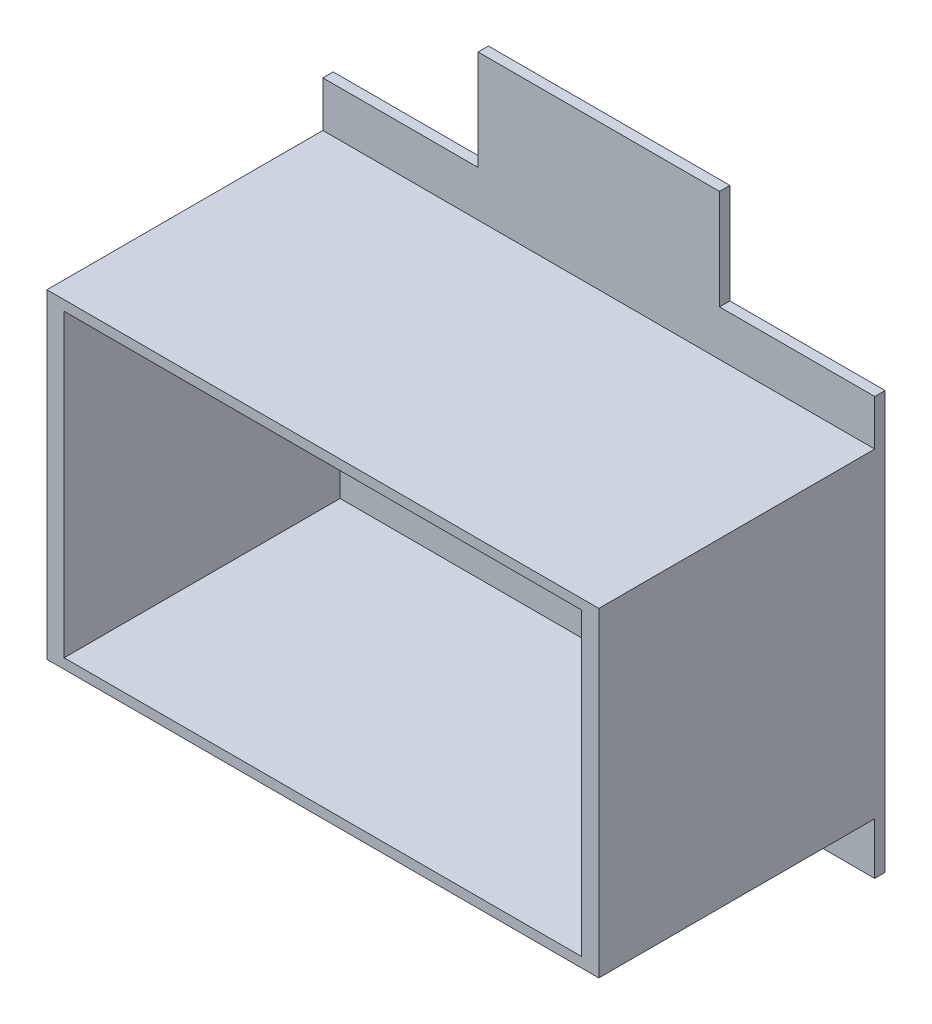
ISO-10303-21;
HEADER;
FILE_DESCRIPTION(('STEP AP214'),'2;1');
FILE_NAME('part.step','',(''),(''),'','','');
FILE_SCHEMA(('AUTOMOTIVE_DESIGN { 1 0 10303 214 1 1 1 1 }'));
ENDSEC;
DATA;
#1=APPLICATION_CONTEXT('core data for automotive mechanical design processes');
#2=APPLICATION_PROTOCOL_DEFINITION('international standard','automotive_design',2000,#1);
#3=PRODUCT_CONTEXT('',#1,'mechanical');
#4=PRODUCT('Part','Part','',(#3));
#5=PRODUCT_RELATED_PRODUCT_CATEGORY('part','',(#4));
#6=PRODUCT_DEFINITION_FORMATION('','',#4);
#7=PRODUCT_DEFINITION_CONTEXT('part definition',#1,'design');
#8=PRODUCT_DEFINITION('design','',#6,#7);
#9=PRODUCT_DEFINITION_SHAPE('','',#8);
#10=(LENGTH_UNIT() NAMED_UNIT(*) SI_UNIT(.MILLI.,.METRE.));
#11=(NAMED_UNIT(*) PLANE_ANGLE_UNIT() SI_UNIT($,.RADIAN.));
#12=(NAMED_UNIT(*) SI_UNIT($,.STERADIAN.) SOLID_ANGLE_UNIT());
#13=UNCERTAINTY_MEASURE_WITH_UNIT(LENGTH_MEASURE(1.E-05),#10,'distance_accuracy_value','');
#14=(GEOMETRIC_REPRESENTATION_CONTEXT(3) GLOBAL_UNCERTAINTY_ASSIGNED_CONTEXT((#13)) GLOBAL_UNIT_ASSIGNED_CONTEXT((#10,
#11,#12)) REPRESENTATION_CONTEXT('',''));
#15=CARTESIAN_POINT('',(0.,0.,0.));
#16=DIRECTION('',(0.,0.,1.));
#17=DIRECTION('',(1.,0.,0.));
#18=AXIS2_PLACEMENT_3D('',#15,#16,#17);
#19=CARTESIAN_POINT('',(0.,0.,3.));
#20=DIRECTION('',(0.,0.,1.));
#21=DIRECTION('',(1.,0.,0.));
#22=AXIS2_PLACEMENT_3D('',#19,#20,#21);
#23=PLANE('',#22);
#24=DIRECTION('',(1.,0.,0.));
#25=VECTOR('',#24,1.);
#26=CARTESIAN_POINT('',(-80.,-60.,3.));
#27=LINE('',#26,#25);
#28=CARTESIAN_POINT('',(-80.,-60.,3.));
#29=VERTEX_POINT('',#28);
#30=CARTESIAN_POINT('',(80.,-60.,3.));
#31=VERTEX_POINT('',#30);
#32=EDGE_CURVE('E230',#29,#31,#27,.T.);
#33=ORIENTED_EDGE('',*,*,#32,.F.);
#34=DIRECTION('',(0.,-1.,0.));
#35=VECTOR('',#34,1.);
#36=CARTESIAN_POINT('',(-80.,75.,3.));
#37=LINE('',#36,#35);
#38=CARTESIAN_POINT('',(-80.,-75.,3.));
#39=VERTEX_POINT('',#38);
#40=EDGE_CURVE('E200',#29,#39,#37,.T.);
#41=ORIENTED_EDGE('',*,*,#40,.T.);
#42=DIRECTION('',(1.,0.,0.));
#43=VECTOR('',#42,1.);
#44=CARTESIAN_POINT('',(-80.,-75.,3.));
#45=LINE('',#44,#43);
#46=CARTESIAN_POINT('',(80.,-75.,3.));
#47=VERTEX_POINT('',#46);
#48=EDGE_CURVE('E190',#39,#47,#45,.T.);
#49=ORIENTED_EDGE('',*,*,#48,.T.);
#50=DIRECTION('',(0.,1.,0.));
#51=VECTOR('',#50,1.);
#52=CARTESIAN_POINT('',(80.,75.,3.));
#53=LINE('',#52,#51);
#54=EDGE_CURVE('E218',#47,#31,#53,.T.);
#55=ORIENTED_EDGE('',*,*,#54,.T.);
#56=EDGE_LOOP('',(#33,#41,#49,#55));
#57=FACE_BOUND('',#56,.T.);
#58=ADVANCED_FACE('F39',(#57),#23,.T.);
#59=CARTESIAN_POINT('',(80.,75.,3.));
#60=DIRECTION('',(-1.,0.,0.));
#61=DIRECTION('',(0.,-1.,0.));
#62=AXIS2_PLACEMENT_3D('',#59,#60,#61);
#63=PLANE('',#62);
#64=DIRECTION('',(0.,1.,0.));
#65=VECTOR('',#64,1.);
#66=CARTESIAN_POINT('',(80.,75.,0.));
#67=LINE('',#66,#65);
#68=CARTESIAN_POINT('',(80.,-75.,0.));
#69=VERTEX_POINT('',#68);
#70=CARTESIAN_POINT('',(80.,46.,0.));
#71=VERTEX_POINT('',#70);
#72=EDGE_CURVE('E185',#69,#71,#67,.T.);
#73=ORIENTED_EDGE('',*,*,#72,.T.);
#74=DIRECTION('',(0.,0.,1.));
#75=VECTOR('',#74,1.);
#76=CARTESIAN_POINT('',(80.,46.,0.));
#77=LINE('',#76,#75);
#78=CARTESIAN_POINT('',(80.,46.,3.));
#79=VERTEX_POINT('',#78);
#80=EDGE_CURVE('E315',#71,#79,#77,.T.);
#81=ORIENTED_EDGE('',*,*,#80,.T.);
#82=CARTESIAN_POINT('',(80.,32.8,3.));
#83=VERTEX_POINT('',#82);
#84=EDGE_CURVE('E182',#83,#79,#53,.T.);
#85=ORIENTED_EDGE('',*,*,#84,.F.);
#86=DIRECTION('',(0.,0.,-1.));
#87=VECTOR('',#86,1.);
#88=CARTESIAN_POINT('',(80.,32.8,83.));
#89=LINE('',#88,#87);
#90=CARTESIAN_POINT('',(80.,32.8,83.));
#91=VERTEX_POINT('',#90);
#92=EDGE_CURVE('E204',#91,#83,#89,.T.);
#93=ORIENTED_EDGE('',*,*,#92,.F.);
#94=DIRECTION('',(0.,1.,0.));
#95=VECTOR('',#94,1.);
#96=CARTESIAN_POINT('',(80.,32.8,83.));
#97=LINE('',#96,#95);
#98=CARTESIAN_POINT('',(80.,-60.,83.));
#99=VERTEX_POINT('',#98);
#100=EDGE_CURVE('E243',#99,#91,#97,.T.);
#101=ORIENTED_EDGE('',*,*,#100,.F.);
#102=DIRECTION('',(0.,0.,-1.));
#103=VECTOR('',#102,1.);
#104=CARTESIAN_POINT('',(80.,-60.,83.));
#105=LINE('',#104,#103);
#106=EDGE_CURVE('E238',#99,#31,#105,.T.);
#107=ORIENTED_EDGE('',*,*,#106,.T.);
#108=ORIENTED_EDGE('',*,*,#54,.F.);
#109=DIRECTION('',(0.,0.,-1.));
#110=VECTOR('',#109,1.);
#111=CARTESIAN_POINT('',(80.,-75.,3.));
#112=LINE('',#111,#110);
#113=EDGE_CURVE('E48',#47,#69,#112,.T.);
#114=ORIENTED_EDGE('',*,*,#113,.T.);
#115=EDGE_LOOP('',(#73,#81,#85,#93,#101,#107,#108,#114));
#116=FACE_BOUND('',#115,.T.);
#117=ADVANCED_FACE('F41',(#116),#63,.F.);
#118=CARTESIAN_POINT('',(-80.,75.,3.));
#119=DIRECTION('',(0.,-1.,0.));
#120=DIRECTION('',(0.,0.,-1.));
#121=AXIS2_PLACEMENT_3D('',#118,#119,#120);
#122=PLANE('',#121);
#123=DIRECTION('',(-1.,0.,0.));
#124=VECTOR('',#123,1.);
#125=CARTESIAN_POINT('',(-80.,75.,0.));
#126=LINE('',#125,#124);
#127=CARTESIAN_POINT('',(35.,75.,0.));
#128=VERTEX_POINT('',#127);
#129=CARTESIAN_POINT('',(-35.,75.,0.));
#130=VERTEX_POINT('',#129);
#131=EDGE_CURVE('E178',#128,#130,#126,.T.);
#132=ORIENTED_EDGE('',*,*,#131,.T.);
#133=DIRECTION('',(0.,0.,1.));
#134=VECTOR('',#133,1.);
#135=CARTESIAN_POINT('',(-35.,75.,0.));
#136=LINE('',#135,#134);
#137=CARTESIAN_POINT('',(-35.,75.,3.));
#138=VERTEX_POINT('',#137);
#139=EDGE_CURVE('E297',#130,#138,#136,.T.);
#140=ORIENTED_EDGE('',*,*,#139,.T.);
#141=DIRECTION('',(-1.,0.,0.));
#142=VECTOR('',#141,1.);
#143=CARTESIAN_POINT('',(-80.,75.,3.));
#144=LINE('',#143,#142);
#145=CARTESIAN_POINT('',(35.,75.,3.));
#146=VERTEX_POINT('',#145);
#147=EDGE_CURVE('E220',#146,#138,#144,.T.);
#148=ORIENTED_EDGE('',*,*,#147,.F.);
#149=DIRECTION('',(0.,0.,1.));
#150=VECTOR('',#149,1.);
#151=CARTESIAN_POINT('',(35.,75.,0.));
#152=LINE('',#151,#150);
#153=EDGE_CURVE('E309',#128,#146,#152,.T.);
#154=ORIENTED_EDGE('',*,*,#153,.F.);
#155=EDGE_LOOP('',(#132,#140,#148,#154));
#156=FACE_BOUND('',#155,.T.);
#157=ADVANCED_FACE('F345',(#156),#122,.F.);
#158=CARTESIAN_POINT('',(-80.,75.,3.));
#159=DIRECTION('',(1.,0.,0.));
#160=DIRECTION('',(0.,1.,0.));
#161=AXIS2_PLACEMENT_3D('',#158,#159,#160);
#162=PLANE('',#161);
#163=CARTESIAN_POINT('',(-80.,46.,3.));
#164=VERTEX_POINT('',#163);
#165=CARTESIAN_POINT('',(-80.,32.8,3.));
#166=VERTEX_POINT('',#165);
#167=EDGE_CURVE('E170',#164,#166,#37,.T.);
#168=ORIENTED_EDGE('',*,*,#167,.F.);
#169=DIRECTION('',(0.,0.,1.));
#170=VECTOR('',#169,1.);
#171=CARTESIAN_POINT('',(-80.,46.,0.));
#172=LINE('',#171,#170);
#173=CARTESIAN_POINT('',(-80.,46.,0.));
#174=VERTEX_POINT('',#173);
#175=EDGE_CURVE('E156',#174,#164,#172,.T.);
#176=ORIENTED_EDGE('',*,*,#175,.F.);
#177=DIRECTION('',(0.,-1.,0.));
#178=VECTOR('',#177,1.);
#179=CARTESIAN_POINT('',(-80.,75.,0.));
#180=LINE('',#179,#178);
#181=CARTESIAN_POINT('',(-80.,-75.,0.));
#182=VERTEX_POINT('',#181);
#183=EDGE_CURVE('E168',#174,#182,#180,.T.);
#184=ORIENTED_EDGE('',*,*,#183,.T.);
#185=DIRECTION('',(0.,0.,-1.));
#186=VECTOR('',#185,1.);
#187=CARTESIAN_POINT('',(-80.,-75.,3.));
#188=LINE('',#187,#186);
#189=EDGE_CURVE('E11',#39,#182,#188,.T.);
#190=ORIENTED_EDGE('',*,*,#189,.F.);
#191=ORIENTED_EDGE('',*,*,#40,.F.);
#192=DIRECTION('',(0.,0.,-1.));
#193=VECTOR('',#192,1.);
#194=CARTESIAN_POINT('',(-80.,-60.,83.));
#195=LINE('',#194,#193);
#196=CARTESIAN_POINT('',(-80.,-60.,83.));
#197=VERTEX_POINT('',#196);
#198=EDGE_CURVE('E214',#197,#29,#195,.T.);
#199=ORIENTED_EDGE('',*,*,#198,.F.);
#200=DIRECTION('',(0.,-1.,0.));
#201=VECTOR('',#200,1.);
#202=CARTESIAN_POINT('',(-80.,32.8,83.));
#203=LINE('',#202,#201);
#204=CARTESIAN_POINT('',(-80.,32.8,83.));
#205=VERTEX_POINT('',#204);
#206=EDGE_CURVE('E260',#205,#197,#203,.T.);
#207=ORIENTED_EDGE('',*,*,#206,.F.);
#208=DIRECTION('',(0.,0.,-1.));
#209=VECTOR('',#208,1.);
#210=CARTESIAN_POINT('',(-80.,32.8,83.));
#211=LINE('',#210,#209);
#212=EDGE_CURVE('E208',#205,#166,#211,.T.);
#213=ORIENTED_EDGE('',*,*,#212,.T.);
#214=EDGE_LOOP('',(#168,#176,#184,#190,#191,#199,#207,#213));
#215=FACE_BOUND('',#214,.T.);
#216=ADVANCED_FACE('F166',(#215),#162,.F.);
#217=CARTESIAN_POINT('',(-80.,-75.,3.));
#218=DIRECTION('',(0.,1.,0.));
#219=DIRECTION('',(0.,0.,1.));
#220=AXIS2_PLACEMENT_3D('',#217,#218,#219);
#221=PLANE('',#220);
#222=DIRECTION('',(1.,0.,0.));
#223=VECTOR('',#222,1.);
#224=CARTESIAN_POINT('',(-80.,-75.,0.));
#225=LINE('',#224,#223);
#226=EDGE_CURVE('E176',#182,#69,#225,.T.);
#227=ORIENTED_EDGE('',*,*,#226,.T.);
#228=ORIENTED_EDGE('',*,*,#113,.F.);
#229=ORIENTED_EDGE('',*,*,#48,.F.);
#230=ORIENTED_EDGE('',*,*,#189,.T.);
#231=EDGE_LOOP('',(#227,#228,#229,#230));
#232=FACE_BOUND('',#231,.T.);
#233=ADVANCED_FACE('F234',(#232),#221,.F.);
#234=DIRECTION('',(0.,1.,0.));
#235=VECTOR('',#234,1.);
#236=CARTESIAN_POINT('',(-35.,75.,3.));
#237=LINE('',#236,#235);
#238=CARTESIAN_POINT('',(-35.,46.,3.));
#239=VERTEX_POINT('',#238);
#240=EDGE_CURVE('E162',#239,#138,#237,.T.);
#241=ORIENTED_EDGE('',*,*,#240,.F.);
#242=DIRECTION('',(1.,0.,0.));
#243=VECTOR('',#242,1.);
#244=CARTESIAN_POINT('',(-80.,46.,3.));
#245=LINE('',#244,#243);
#246=EDGE_CURVE('E318',#164,#239,#245,.T.);
#247=ORIENTED_EDGE('',*,*,#246,.F.);
#248=ORIENTED_EDGE('',*,*,#167,.T.);
#249=DIRECTION('',(-1.,0.,0.));
#250=VECTOR('',#249,1.);
#251=CARTESIAN_POINT('',(-80.,32.8,3.));
#252=LINE('',#251,#250);
#253=EDGE_CURVE('E244',#83,#166,#252,.T.);
#254=ORIENTED_EDGE('',*,*,#253,.F.);
#255=ORIENTED_EDGE('',*,*,#84,.T.);
#256=DIRECTION('',(1.,0.,0.));
#257=VECTOR('',#256,1.);
#258=CARTESIAN_POINT('',(80.,46.,3.));
#259=LINE('',#258,#257);
#260=CARTESIAN_POINT('',(35.,46.,3.));
#261=VERTEX_POINT('',#260);
#262=EDGE_CURVE('E319',#261,#79,#259,.T.);
#263=ORIENTED_EDGE('',*,*,#262,.F.);
#264=DIRECTION('',(0.,-1.,0.));
#265=VECTOR('',#264,1.);
#266=CARTESIAN_POINT('',(35.,75.,3.));
#267=LINE('',#266,#265);
#268=EDGE_CURVE('E323',#146,#261,#267,.T.);
#269=ORIENTED_EDGE('',*,*,#268,.F.);
#270=ORIENTED_EDGE('',*,*,#147,.T.);
#271=EDGE_LOOP('',(#241,#247,#248,#254,#255,#263,#269,#270));
#272=FACE_BOUND('',#271,.T.);
#273=ADVANCED_FACE('F349',(#272),#23,.T.);
#274=CARTESIAN_POINT('',(0.,0.,0.));
#275=DIRECTION('',(0.,0.,1.));
#276=DIRECTION('',(1.,0.,0.));
#277=AXIS2_PLACEMENT_3D('',#274,#275,#276);
#278=PLANE('',#277);
#279=DIRECTION('',(1.,0.,0.));
#280=VECTOR('',#279,1.);
#281=CARTESIAN_POINT('',(-80.,46.,0.));
#282=LINE('',#281,#280);
#283=CARTESIAN_POINT('',(-35.,46.,0.));
#284=VERTEX_POINT('',#283);
#285=EDGE_CURVE('E152',#174,#284,#282,.T.);
#286=ORIENTED_EDGE('',*,*,#285,.T.);
#287=DIRECTION('',(0.,1.,0.));
#288=VECTOR('',#287,1.);
#289=CARTESIAN_POINT('',(-35.,75.,0.));
#290=LINE('',#289,#288);
#291=EDGE_CURVE('E55',#284,#130,#290,.T.);
#292=ORIENTED_EDGE('',*,*,#291,.T.);
#293=ORIENTED_EDGE('',*,*,#131,.F.);
#294=DIRECTION('',(0.,-1.,0.));
#295=VECTOR('',#294,1.);
#296=CARTESIAN_POINT('',(35.,75.,0.));
#297=LINE('',#296,#295);
#298=CARTESIAN_POINT('',(35.,46.,0.));
#299=VERTEX_POINT('',#298);
#300=EDGE_CURVE('E322',#128,#299,#297,.T.);
#301=ORIENTED_EDGE('',*,*,#300,.T.);
#302=DIRECTION('',(1.,0.,0.));
#303=VECTOR('',#302,1.);
#304=CARTESIAN_POINT('',(80.,46.,0.));
#305=LINE('',#304,#303);
#306=EDGE_CURVE('E63',#299,#71,#305,.T.);
#307=ORIENTED_EDGE('',*,*,#306,.T.);
#308=ORIENTED_EDGE('',*,*,#72,.F.);
#309=ORIENTED_EDGE('',*,*,#226,.F.);
#310=ORIENTED_EDGE('',*,*,#183,.F.);
#311=EDGE_LOOP('',(#286,#292,#293,#301,#307,#308,#309,#310));
#312=FACE_BOUND('',#311,.T.);
#313=ADVANCED_FACE('F174',(#312),#278,.F.);
#314=CARTESIAN_POINT('',(0.,0.,83.));
#315=DIRECTION('',(0.,0.,1.));
#316=DIRECTION('',(1.,0.,0.));
#317=AXIS2_PLACEMENT_3D('',#314,#315,#316);
#318=PLANE('',#317);
#319=ORIENTED_EDGE('',*,*,#100,.T.);
#320=DIRECTION('',(-1.,0.,0.));
#321=VECTOR('',#320,1.);
#322=CARTESIAN_POINT('',(-80.,32.8,83.));
#323=LINE('',#322,#321);
#324=EDGE_CURVE('E249',#91,#205,#323,.T.);
#325=ORIENTED_EDGE('',*,*,#324,.T.);
#326=ORIENTED_EDGE('',*,*,#206,.T.);
#327=DIRECTION('',(1.,0.,0.));
#328=VECTOR('',#327,1.);
#329=CARTESIAN_POINT('',(-80.,-60.,83.));
#330=LINE('',#329,#328);
#331=EDGE_CURVE('E256',#197,#99,#330,.T.);
#332=ORIENTED_EDGE('',*,*,#331,.T.);
#333=EDGE_LOOP('',(#319,#325,#326,#332));
#334=FACE_BOUND('',#333,.T.);
#335=DIRECTION('',(-1.,0.,0.));
#336=VECTOR('',#335,1.);
#337=CARTESIAN_POINT('',(-75.,29.9,83.));
#338=LINE('',#337,#336);
#339=CARTESIAN_POINT('',(75.,29.9,83.));
#340=VERTEX_POINT('',#339);
#341=CARTESIAN_POINT('',(-75.,29.9,83.));
#342=VERTEX_POINT('',#341);
#343=EDGE_CURVE('E304',#340,#342,#338,.T.);
#344=ORIENTED_EDGE('',*,*,#343,.F.);
#345=DIRECTION('',(0.,1.,0.));
#346=VECTOR('',#345,1.);
#347=CARTESIAN_POINT('',(75.,29.9,83.));
#348=LINE('',#347,#346);
#349=CARTESIAN_POINT('',(75.,-57.1,83.));
#350=VERTEX_POINT('',#349);
#351=EDGE_CURVE('E284',#350,#340,#348,.T.);
#352=ORIENTED_EDGE('',*,*,#351,.F.);
#353=DIRECTION('',(1.,0.,0.));
#354=VECTOR('',#353,1.);
#355=CARTESIAN_POINT('',(-75.,-57.1,83.));
#356=LINE('',#355,#354);
#357=CARTESIAN_POINT('',(-75.,-57.1,83.));
#358=VERTEX_POINT('',#357);
#359=EDGE_CURVE('E279',#358,#350,#356,.T.);
#360=ORIENTED_EDGE('',*,*,#359,.F.);
#361=DIRECTION('',(0.,-1.,0.));
#362=VECTOR('',#361,1.);
#363=CARTESIAN_POINT('',(-75.,29.9,83.));
#364=LINE('',#363,#362);
#365=EDGE_CURVE('E300',#342,#358,#364,.T.);
#366=ORIENTED_EDGE('',*,*,#365,.F.);
#367=EDGE_LOOP('',(#344,#352,#360,#366));
#368=FACE_BOUND('',#367,.T.);
#369=ADVANCED_FACE('F354',(#334,#368),#318,.T.);
#370=CARTESIAN_POINT('',(-80.,32.8,83.));
#371=DIRECTION('',(0.,-1.,0.));
#372=DIRECTION('',(1.,0.,0.));
#373=AXIS2_PLACEMENT_3D('',#370,#371,#372);
#374=PLANE('',#373);
#375=ORIENTED_EDGE('',*,*,#253,.T.);
#376=ORIENTED_EDGE('',*,*,#212,.F.);
#377=ORIENTED_EDGE('',*,*,#324,.F.);
#378=ORIENTED_EDGE('',*,*,#92,.T.);
#379=EDGE_LOOP('',(#375,#376,#377,#378));
#380=FACE_BOUND('',#379,.T.);
#381=ADVANCED_FACE('F357',(#380),#374,.F.);
#382=CARTESIAN_POINT('',(-80.,-60.,83.));
#383=DIRECTION('',(0.,1.,0.));
#384=DIRECTION('',(-1.,0.,0.));
#385=AXIS2_PLACEMENT_3D('',#382,#383,#384);
#386=PLANE('',#385);
#387=ORIENTED_EDGE('',*,*,#32,.T.);
#388=ORIENTED_EDGE('',*,*,#106,.F.);
#389=ORIENTED_EDGE('',*,*,#331,.F.);
#390=ORIENTED_EDGE('',*,*,#198,.T.);
#391=EDGE_LOOP('',(#387,#388,#389,#390));
#392=FACE_BOUND('',#391,.T.);
#393=ADVANCED_FACE('F240',(#392),#386,.F.);
#394=CARTESIAN_POINT('',(75.,29.9,83.));
#395=DIRECTION('',(-1.,0.,0.));
#396=DIRECTION('',(0.,-1.,0.));
#397=AXIS2_PLACEMENT_3D('',#394,#395,#396);
#398=PLANE('',#397);
#399=DIRECTION('',(0.,1.,0.));
#400=VECTOR('',#399,1.);
#401=CARTESIAN_POINT('',(75.,29.9,3.));
#402=LINE('',#401,#400);
#403=CARTESIAN_POINT('',(75.,-57.1,3.));
#404=VERTEX_POINT('',#403);
#405=CARTESIAN_POINT('',(75.,29.9,3.));
#406=VERTEX_POINT('',#405);
#407=EDGE_CURVE('E293',#404,#406,#402,.T.);
#408=ORIENTED_EDGE('',*,*,#407,.F.);
#409=DIRECTION('',(0.,0.,-1.));
#410=VECTOR('',#409,1.);
#411=CARTESIAN_POINT('',(75.,-57.1,83.));
#412=LINE('',#411,#410);
#413=EDGE_CURVE('E276',#350,#404,#412,.T.);
#414=ORIENTED_EDGE('',*,*,#413,.F.);
#415=ORIENTED_EDGE('',*,*,#351,.T.);
#416=DIRECTION('',(0.,0.,-1.));
#417=VECTOR('',#416,1.);
#418=CARTESIAN_POINT('',(75.,29.9,83.));
#419=LINE('',#418,#417);
#420=EDGE_CURVE('E251',#340,#406,#419,.T.);
#421=ORIENTED_EDGE('',*,*,#420,.T.);
#422=EDGE_LOOP('',(#408,#414,#415,#421));
#423=FACE_BOUND('',#422,.T.);
#424=ADVANCED_FACE('F464',(#423),#398,.T.);
#425=CARTESIAN_POINT('',(-75.,29.9,83.));
#426=DIRECTION('',(0.,-1.,0.));
#427=DIRECTION('',(1.,0.,0.));
#428=AXIS2_PLACEMENT_3D('',#425,#426,#427);
#429=PLANE('',#428);
#430=DIRECTION('',(-1.,0.,0.));
#431=VECTOR('',#430,1.);
#432=CARTESIAN_POINT('',(-75.,29.9,3.));
#433=LINE('',#432,#431);
#434=CARTESIAN_POINT('',(-75.,29.9,3.));
#435=VERTEX_POINT('',#434);
#436=EDGE_CURVE('E289',#406,#435,#433,.T.);
#437=ORIENTED_EDGE('',*,*,#436,.F.);
#438=ORIENTED_EDGE('',*,*,#420,.F.);
#439=ORIENTED_EDGE('',*,*,#343,.T.);
#440=DIRECTION('',(0.,0.,-1.));
#441=VECTOR('',#440,1.);
#442=CARTESIAN_POINT('',(-75.,29.9,83.));
#443=LINE('',#442,#441);
#444=EDGE_CURVE('E270',#342,#435,#443,.T.);
#445=ORIENTED_EDGE('',*,*,#444,.T.);
#446=EDGE_LOOP('',(#437,#438,#439,#445));
#447=FACE_BOUND('',#446,.T.);
#448=ADVANCED_FACE('F456',(#447),#429,.T.);
#449=CARTESIAN_POINT('',(-75.,29.9,83.));
#450=DIRECTION('',(1.,0.,0.));
#451=DIRECTION('',(0.,1.,0.));
#452=AXIS2_PLACEMENT_3D('',#449,#450,#451);
#453=PLANE('',#452);
#454=DIRECTION('',(0.,-1.,0.));
#455=VECTOR('',#454,1.);
#456=CARTESIAN_POINT('',(-75.,29.9,3.));
#457=LINE('',#456,#455);
#458=CARTESIAN_POINT('',(-75.,-57.1,3.));
#459=VERTEX_POINT('',#458);
#460=EDGE_CURVE('E285',#435,#459,#457,.T.);
#461=ORIENTED_EDGE('',*,*,#460,.F.);
#462=ORIENTED_EDGE('',*,*,#444,.F.);
#463=ORIENTED_EDGE('',*,*,#365,.T.);
#464=DIRECTION('',(0.,0.,-1.));
#465=VECTOR('',#464,1.);
#466=CARTESIAN_POINT('',(-75.,-57.1,83.));
#467=LINE('',#466,#465);
#468=EDGE_CURVE('E273',#358,#459,#467,.T.);
#469=ORIENTED_EDGE('',*,*,#468,.T.);
#470=EDGE_LOOP('',(#461,#462,#463,#469));
#471=FACE_BOUND('',#470,.T.);
#472=ADVANCED_FACE('F449',(#471),#453,.T.);
#473=CARTESIAN_POINT('',(-75.,-57.1,83.));
#474=DIRECTION('',(0.,1.,0.));
#475=DIRECTION('',(-1.,0.,0.));
#476=AXIS2_PLACEMENT_3D('',#473,#474,#475);
#477=PLANE('',#476);
#478=DIRECTION('',(1.,0.,0.));
#479=VECTOR('',#478,1.);
#480=CARTESIAN_POINT('',(-75.,-57.1,3.));
#481=LINE('',#480,#479);
#482=EDGE_CURVE('E280',#459,#404,#481,.T.);
#483=ORIENTED_EDGE('',*,*,#482,.F.);
#484=ORIENTED_EDGE('',*,*,#468,.F.);
#485=ORIENTED_EDGE('',*,*,#359,.T.);
#486=ORIENTED_EDGE('',*,*,#413,.T.);
#487=EDGE_LOOP('',(#483,#484,#485,#486));
#488=FACE_BOUND('',#487,.T.);
#489=ADVANCED_FACE('F376',(#488),#477,.T.);
#490=ORIENTED_EDGE('',*,*,#482,.T.);
#491=ORIENTED_EDGE('',*,*,#407,.T.);
#492=ORIENTED_EDGE('',*,*,#436,.T.);
#493=ORIENTED_EDGE('',*,*,#460,.T.);
#494=EDGE_LOOP('',(#490,#491,#492,#493));
#495=FACE_BOUND('',#494,.T.);
#496=ADVANCED_FACE('F369',(#495),#23,.T.);
#497=CARTESIAN_POINT('',(80.,46.,0.));
#498=DIRECTION('',(0.,-1.,0.));
#499=DIRECTION('',(0.,0.,-1.));
#500=AXIS2_PLACEMENT_3D('',#497,#498,#499);
#501=PLANE('',#500);
#502=ORIENTED_EDGE('',*,*,#262,.T.);
#503=ORIENTED_EDGE('',*,*,#80,.F.);
#504=ORIENTED_EDGE('',*,*,#306,.F.);
#505=DIRECTION('',(0.,0.,1.));
#506=VECTOR('',#505,1.);
#507=CARTESIAN_POINT('',(35.,46.,0.));
#508=LINE('',#507,#506);
#509=EDGE_CURVE('E312',#299,#261,#508,.T.);
#510=ORIENTED_EDGE('',*,*,#509,.T.);
#511=EDGE_LOOP('',(#502,#503,#504,#510));
#512=FACE_BOUND('',#511,.T.);
#513=ADVANCED_FACE('F352',(#512),#501,.F.);
#514=CARTESIAN_POINT('',(35.,75.,0.));
#515=DIRECTION('',(-1.,0.,0.));
#516=DIRECTION('',(0.,-1.,0.));
#517=AXIS2_PLACEMENT_3D('',#514,#515,#516);
#518=PLANE('',#517);
#519=ORIENTED_EDGE('',*,*,#268,.T.);
#520=ORIENTED_EDGE('',*,*,#509,.F.);
#521=ORIENTED_EDGE('',*,*,#300,.F.);
#522=ORIENTED_EDGE('',*,*,#153,.T.);
#523=EDGE_LOOP('',(#519,#520,#521,#522));
#524=FACE_BOUND('',#523,.T.);
#525=ADVANCED_FACE('F347',(#524),#518,.F.);
#526=CARTESIAN_POINT('',(-35.,75.,0.));
#527=DIRECTION('',(1.,0.,0.));
#528=DIRECTION('',(0.,1.,0.));
#529=AXIS2_PLACEMENT_3D('',#526,#527,#528);
#530=PLANE('',#529);
#531=ORIENTED_EDGE('',*,*,#240,.T.);
#532=ORIENTED_EDGE('',*,*,#139,.F.);
#533=ORIENTED_EDGE('',*,*,#291,.F.);
#534=DIRECTION('',(0.,0.,1.));
#535=VECTOR('',#534,1.);
#536=CARTESIAN_POINT('',(-35.,46.,0.));
#537=LINE('',#536,#535);
#538=EDGE_CURVE('E158',#284,#239,#537,.T.);
#539=ORIENTED_EDGE('',*,*,#538,.T.);
#540=EDGE_LOOP('',(#531,#532,#533,#539));
#541=FACE_BOUND('',#540,.T.);
#542=ADVANCED_FACE('F358',(#541),#530,.F.);
#543=CARTESIAN_POINT('',(-80.,46.,0.));
#544=DIRECTION('',(0.,-1.,0.));
#545=DIRECTION('',(0.,0.,-1.));
#546=AXIS2_PLACEMENT_3D('',#543,#544,#545);
#547=PLANE('',#546);
#548=ORIENTED_EDGE('',*,*,#246,.T.);
#549=ORIENTED_EDGE('',*,*,#538,.F.);
#550=ORIENTED_EDGE('',*,*,#285,.F.);
#551=ORIENTED_EDGE('',*,*,#175,.T.);
#552=EDGE_LOOP('',(#548,#549,#550,#551));
#553=FACE_BOUND('',#552,.T.);
#554=ADVANCED_FACE('F155',(#553),#547,.F.);
#555=CLOSED_SHELL('',(#58,#117,#157,#216,#233,#273,#313,#369,#381,#393,#424,#448,#472,#489,#496,
#513,#525,#542,#554));
#556=MANIFOLD_SOLID_BREP('B2',#555);
#557=ADVANCED_BREP_SHAPE_REPRESENTATION('',(#18,#556),#14);
#558=SHAPE_DEFINITION_REPRESENTATION(#9,#557);
ENDSEC;
END-ISO-10303-21;
